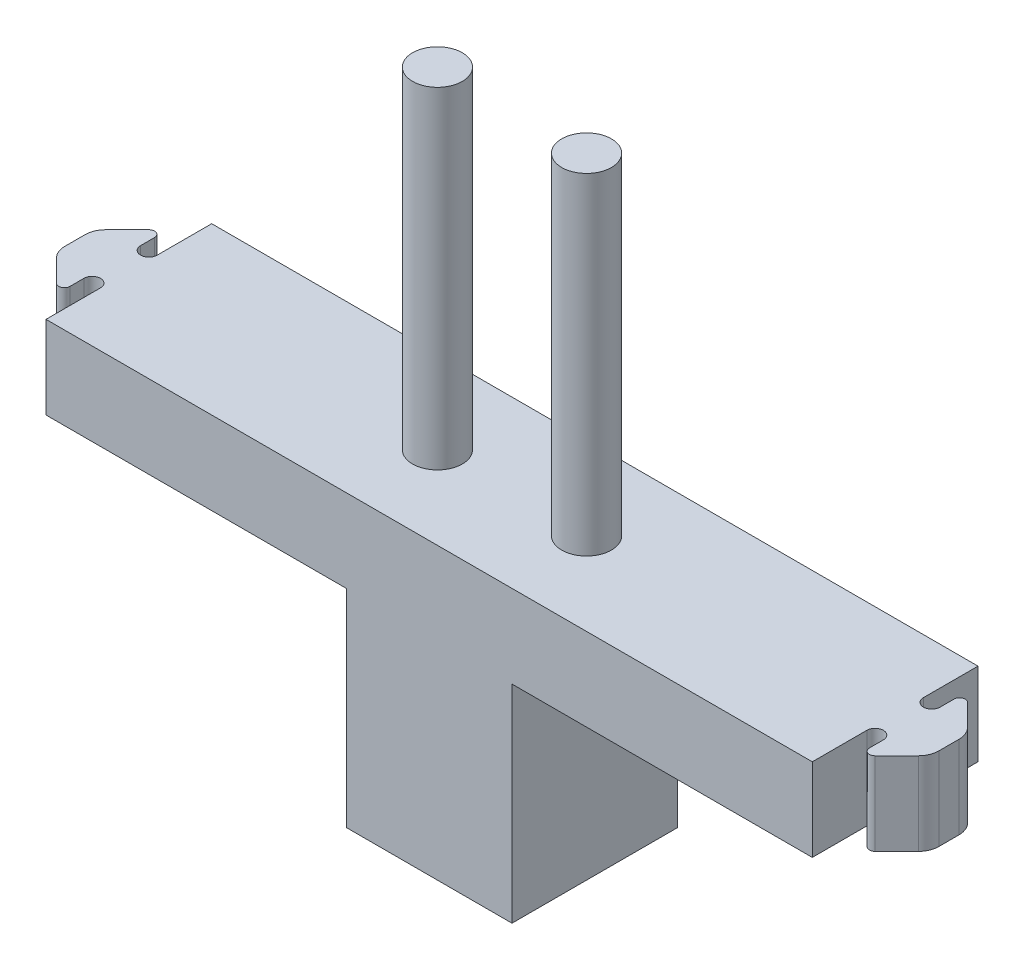
ISO-10303-21;
HEADER;
FILE_DESCRIPTION(('STEP AP214'),'2;1');
FILE_NAME('part.step','',(''),(''),'','','');
FILE_SCHEMA(('AUTOMOTIVE_DESIGN { 1 0 10303 214 1 1 1 1 }'));
ENDSEC;
DATA;
#1=APPLICATION_CONTEXT('core data for automotive mechanical design processes');
#2=APPLICATION_PROTOCOL_DEFINITION('international standard','automotive_design',2000,#1);
#3=PRODUCT_CONTEXT('',#1,'mechanical');
#4=PRODUCT('Part','Part','',(#3));
#5=PRODUCT_RELATED_PRODUCT_CATEGORY('part','',(#4));
#6=PRODUCT_DEFINITION_FORMATION('','',#4);
#7=PRODUCT_DEFINITION_CONTEXT('part definition',#1,'design');
#8=PRODUCT_DEFINITION('design','',#6,#7);
#9=PRODUCT_DEFINITION_SHAPE('','',#8);
#10=(LENGTH_UNIT() NAMED_UNIT(*) SI_UNIT(.MILLI.,.METRE.));
#11=(NAMED_UNIT(*) PLANE_ANGLE_UNIT() SI_UNIT($,.RADIAN.));
#12=(NAMED_UNIT(*) SI_UNIT($,.STERADIAN.) SOLID_ANGLE_UNIT());
#13=UNCERTAINTY_MEASURE_WITH_UNIT(LENGTH_MEASURE(1.E-05),#10,'distance_accuracy_value','');
#14=(GEOMETRIC_REPRESENTATION_CONTEXT(3) GLOBAL_UNCERTAINTY_ASSIGNED_CONTEXT((#13)) GLOBAL_UNIT_ASSIGNED_CONTEXT((#10,
#11,#12)) REPRESENTATION_CONTEXT('',''));
#15=CARTESIAN_POINT('',(0.,0.,0.));
#16=DIRECTION('',(0.,0.,1.));
#17=DIRECTION('',(1.,0.,0.));
#18=AXIS2_PLACEMENT_3D('',#15,#16,#17);
#19=CARTESIAN_POINT('',(0.,0.,0.));
#20=DIRECTION('',(0.,-1.,0.));
#21=DIRECTION('',(0.,0.,-1.));
#22=AXIS2_PLACEMENT_3D('',#19,#20,#21);
#23=PLANE('',#22);
#24=DIRECTION('',(-1.,0.,0.));
#25=VECTOR('',#24,1.);
#26=CARTESIAN_POINT('',(0.,0.,25.4));
#27=LINE('',#26,#25);
#28=CARTESIAN_POINT('',(0.,0.,25.4));
#29=VERTEX_POINT('',#28);
#30=CARTESIAN_POINT('',(-46.0375,0.,25.4));
#31=VERTEX_POINT('',#30);
#32=EDGE_CURVE('E567',#29,#31,#27,.T.);
#33=ORIENTED_EDGE('',*,*,#32,.T.);
#34=DIRECTION('',(0.,0.,-1.));
#35=VECTOR('',#34,1.);
#36=CARTESIAN_POINT('',(-46.0375,0.,25.4));
#37=LINE('',#36,#35);
#38=CARTESIAN_POINT('',(-46.0375,0.,0.));
#39=VERTEX_POINT('',#38);
#40=EDGE_CURVE('E282',#31,#39,#37,.T.);
#41=ORIENTED_EDGE('',*,*,#40,.T.);
#42=DIRECTION('',(-1.,0.,0.));
#43=VECTOR('',#42,1.);
#44=CARTESIAN_POINT('',(0.,0.,0.));
#45=LINE('',#44,#43);
#46=CARTESIAN_POINT('',(0.,0.,0.));
#47=VERTEX_POINT('',#46);
#48=EDGE_CURVE('E267',#47,#39,#45,.T.);
#49=ORIENTED_EDGE('',*,*,#48,.F.);
#50=DIRECTION('',(0.,0.,1.));
#51=VECTOR('',#50,1.);
#52=CARTESIAN_POINT('',(0.,0.,0.));
#53=LINE('',#52,#51);
#54=CARTESIAN_POINT('',(0.,0.,8.35659999999997));
#55=VERTEX_POINT('',#54);
#56=EDGE_CURVE('E562',#47,#55,#53,.T.);
#57=ORIENTED_EDGE('',*,*,#56,.T.);
#58=CARTESIAN_POINT('',(1.27000000000001,0.,8.35659999999997));
#59=DIRECTION('',(0.,-1.,0.));
#60=DIRECTION('',(0.,0.,1.));
#61=AXIS2_PLACEMENT_3D('',#58,#59,#60);
#62=CIRCLE('',#61,1.27000000000001);
#63=CARTESIAN_POINT('',(2.54000000000002,0.,8.35659999999997));
#64=VERTEX_POINT('',#63);
#65=EDGE_CURVE('E424',#64,#55,#62,.T.);
#66=ORIENTED_EDGE('',*,*,#65,.F.);
#67=DIRECTION('',(0.,0.,1.));
#68=VECTOR('',#67,1.);
#69=CARTESIAN_POINT('',(2.54000000000002,0.,8.35659999999997));
#70=LINE('',#69,#68);
#71=CARTESIAN_POINT('',(2.54000000000002,0.,6.22299999999997));
#72=VERTEX_POINT('',#71);
#73=EDGE_CURVE('E420',#72,#64,#70,.T.);
#74=ORIENTED_EDGE('',*,*,#73,.F.);
#75=CARTESIAN_POINT('',(3.40360000000002,0.,6.22299999999998));
#76=DIRECTION('',(0.,1.,0.));
#77=DIRECTION('',(0.,0.,-1.));
#78=AXIS2_PLACEMENT_3D('',#75,#76,#77);
#79=CIRCLE('',#78,0.863600000000003);
#80=CARTESIAN_POINT('',(4.01425741623272,0.,5.61234258376727));
#81=VERTEX_POINT('',#80);
#82=EDGE_CURVE('E416',#81,#72,#79,.T.);
#83=ORIENTED_EDGE('',*,*,#82,.F.);
#84=DIRECTION('',(-0.707106781186547,0.,-0.707106781186547));
#85=VECTOR('',#84,1.);
#86=CARTESIAN_POINT('',(4.01425741623272,0.,5.61234258376727));
#87=LINE('',#86,#85);
#88=CARTESIAN_POINT('',(7.33695218102832,0.,8.93503734856287));
#89=VERTEX_POINT('',#88);
#90=EDGE_CURVE('E412',#89,#81,#87,.T.);
#91=ORIENTED_EDGE('',*,*,#90,.F.);
#92=CARTESIAN_POINT('',(5.07627105699759,0.,11.1643748859159));
#93=DIRECTION('',(0.,1.,0.));
#94=DIRECTION('',(0.,0.,-1.));
#95=AXIS2_PLACEMENT_3D('',#92,#93,#94);
#96=CIRCLE('',#95,3.17500000000002);
#97=CARTESIAN_POINT('',(8.25119370011618,0.,11.1865381486048));
#98=VERTEX_POINT('',#97);
#99=EDGE_CURVE('E407',#98,#89,#96,.T.);
#100=ORIENTED_EDGE('',*,*,#99,.F.);
#101=DIRECTION('',(0.,0.,-1.));
#102=VECTOR('',#101,1.);
#103=CARTESIAN_POINT('',(8.25119370011618,0.,11.1865381486048));
#104=LINE('',#103,#102);
#105=CARTESIAN_POINT('',(8.25119370011618,0.,14.2134618513952));
#106=VERTEX_POINT('',#105);
#107=EDGE_CURVE('E403',#106,#98,#104,.T.);
#108=ORIENTED_EDGE('',*,*,#107,.F.);
#109=CARTESIAN_POINT('',(5.07627105699759,0.,14.2356251140841));
#110=DIRECTION('',(0.,-1.,0.));
#111=DIRECTION('',(0.,0.,1.));
#112=AXIS2_PLACEMENT_3D('',#109,#110,#111);
#113=CIRCLE('',#112,3.17500000000002);
#114=CARTESIAN_POINT('',(7.33695218102832,0.,16.4649626514371));
#115=VERTEX_POINT('',#114);
#116=EDGE_CURVE('E308',#106,#115,#113,.T.);
#117=ORIENTED_EDGE('',*,*,#116,.T.);
#118=DIRECTION('',(-0.707106781186547,0.,0.707106781186547));
#119=VECTOR('',#118,1.);
#120=CARTESIAN_POINT('',(4.01425741623272,0.,19.7876574162327));
#121=LINE('',#120,#119);
#122=CARTESIAN_POINT('',(4.01425741623272,0.,19.7876574162327));
#123=VERTEX_POINT('',#122);
#124=EDGE_CURVE('E305',#115,#123,#121,.T.);
#125=ORIENTED_EDGE('',*,*,#124,.T.);
#126=CARTESIAN_POINT('',(3.40360000000002,0.,19.177));
#127=DIRECTION('',(0.,-1.,0.));
#128=DIRECTION('',(0.,0.,1.));
#129=AXIS2_PLACEMENT_3D('',#126,#127,#128);
#130=CIRCLE('',#129,0.863600000000003);
#131=CARTESIAN_POINT('',(2.54000000000002,0.,19.177));
#132=VERTEX_POINT('',#131);
#133=EDGE_CURVE('E302',#123,#132,#130,.T.);
#134=ORIENTED_EDGE('',*,*,#133,.T.);
#135=DIRECTION('',(0.,0.,-1.));
#136=VECTOR('',#135,1.);
#137=CARTESIAN_POINT('',(2.54000000000002,0.,17.0434));
#138=LINE('',#137,#136);
#139=CARTESIAN_POINT('',(2.54000000000002,0.,17.0434));
#140=VERTEX_POINT('',#139);
#141=EDGE_CURVE('E298',#132,#140,#138,.T.);
#142=ORIENTED_EDGE('',*,*,#141,.T.);
#143=CARTESIAN_POINT('',(1.27000000000001,0.,17.0434));
#144=DIRECTION('',(0.,1.,0.));
#145=DIRECTION('',(0.,0.,-1.));
#146=AXIS2_PLACEMENT_3D('',#143,#144,#145);
#147=CIRCLE('',#146,1.27000000000001);
#148=CARTESIAN_POINT('',(0.,0.,17.0434));
#149=VERTEX_POINT('',#148);
#150=EDGE_CURVE('E294',#140,#149,#147,.T.);
#151=ORIENTED_EDGE('',*,*,#150,.T.);
#152=EDGE_CURVE('E539',#149,#29,#53,.T.);
#153=ORIENTED_EDGE('',*,*,#152,.T.);
#154=EDGE_LOOP('',(#33,#41,#49,#57,#66,#74,#83,#91,#100,#108,#117,#125,#134,#142,#151,#153));
#155=FACE_BOUND('',#154,.T.);
#156=ADVANCED_FACE('F39',(#155),#23,.T.);
#157=CARTESIAN_POINT('',(0.,12.7,0.));
#158=DIRECTION('',(1.,0.,0.));
#159=DIRECTION('',(0.,0.,-1.));
#160=AXIS2_PLACEMENT_3D('',#157,#158,#159);
#161=PLANE('',#160);
#162=ORIENTED_EDGE('',*,*,#152,.F.);
#163=DIRECTION('',(0.,1.,0.));
#164=VECTOR('',#163,1.);
#165=CARTESIAN_POINT('',(0.,0.,17.0434));
#166=LINE('',#165,#164);
#167=CARTESIAN_POINT('',(0.,12.7,17.0434));
#168=VERTEX_POINT('',#167);
#169=EDGE_CURVE('E63',#149,#168,#166,.T.);
#170=ORIENTED_EDGE('',*,*,#169,.T.);
#171=DIRECTION('',(0.,0.,1.));
#172=VECTOR('',#171,1.);
#173=CARTESIAN_POINT('',(0.,12.7,0.));
#174=LINE('',#173,#172);
#175=CARTESIAN_POINT('',(0.,12.7,25.4));
#176=VERTEX_POINT('',#175);
#177=EDGE_CURVE('E549',#168,#176,#174,.T.);
#178=ORIENTED_EDGE('',*,*,#177,.T.);
#179=DIRECTION('',(0.,-1.,0.));
#180=VECTOR('',#179,1.);
#181=CARTESIAN_POINT('',(0.,12.7,25.4));
#182=LINE('',#181,#180);
#183=EDGE_CURVE('E561',#176,#29,#182,.T.);
#184=ORIENTED_EDGE('',*,*,#183,.T.);
#185=EDGE_LOOP('',(#162,#170,#178,#184));
#186=FACE_BOUND('',#185,.T.);
#187=ADVANCED_FACE('F41',(#186),#161,.T.);
#188=CARTESIAN_POINT('',(-117.475,12.7,0.));
#189=DIRECTION('',(1.,0.,0.));
#190=DIRECTION('',(0.,0.,-1.));
#191=AXIS2_PLACEMENT_3D('',#188,#189,#190);
#192=PLANE('',#191);
#193=DIRECTION('',(0.,1.,0.));
#194=VECTOR('',#193,1.);
#195=CARTESIAN_POINT('',(-117.475,0.,17.0434));
#196=LINE('',#195,#194);
#197=CARTESIAN_POINT('',(-117.475,0.,17.0434));
#198=VERTEX_POINT('',#197);
#199=CARTESIAN_POINT('',(-117.475,12.7,17.0434));
#200=VERTEX_POINT('',#199);
#201=EDGE_CURVE('E380',#198,#200,#196,.T.);
#202=ORIENTED_EDGE('',*,*,#201,.F.);
#203=DIRECTION('',(0.,0.,1.));
#204=VECTOR('',#203,1.);
#205=CARTESIAN_POINT('',(-117.475,0.,0.));
#206=LINE('',#205,#204);
#207=CARTESIAN_POINT('',(-117.475,0.,25.4));
#208=VERTEX_POINT('',#207);
#209=EDGE_CURVE('E571',#198,#208,#206,.T.);
#210=ORIENTED_EDGE('',*,*,#209,.T.);
#211=DIRECTION('',(0.,-1.,0.));
#212=VECTOR('',#211,1.);
#213=CARTESIAN_POINT('',(-117.475,12.7,25.4));
#214=LINE('',#213,#212);
#215=CARTESIAN_POINT('',(-117.475,12.7,25.4));
#216=VERTEX_POINT('',#215);
#217=EDGE_CURVE('E584',#216,#208,#214,.T.);
#218=ORIENTED_EDGE('',*,*,#217,.F.);
#219=DIRECTION('',(0.,0.,1.));
#220=VECTOR('',#219,1.);
#221=CARTESIAN_POINT('',(-117.475,12.7,0.));
#222=LINE('',#221,#220);
#223=EDGE_CURVE('E553',#200,#216,#222,.T.);
#224=ORIENTED_EDGE('',*,*,#223,.F.);
#225=EDGE_LOOP('',(#202,#210,#218,#224));
#226=FACE_BOUND('',#225,.T.);
#227=ADVANCED_FACE('F612',(#226),#192,.F.);
#228=CARTESIAN_POINT('',(0.,12.7,0.));
#229=VERTEX_POINT('',#228);
#230=CARTESIAN_POINT('',(0.,12.7,8.35659999999997));
#231=VERTEX_POINT('',#230);
#232=EDGE_CURVE('E544',#229,#231,#174,.T.);
#233=ORIENTED_EDGE('',*,*,#232,.T.);
#234=DIRECTION('',(0.,1.,0.));
#235=VECTOR('',#234,1.);
#236=CARTESIAN_POINT('',(0.,0.,8.35659999999997));
#237=LINE('',#236,#235);
#238=EDGE_CURVE('E450',#55,#231,#237,.T.);
#239=ORIENTED_EDGE('',*,*,#238,.F.);
#240=ORIENTED_EDGE('',*,*,#56,.F.);
#241=DIRECTION('',(0.,-1.,0.));
#242=VECTOR('',#241,1.);
#243=CARTESIAN_POINT('',(0.,12.7,0.));
#244=LINE('',#243,#242);
#245=EDGE_CURVE('E543',#229,#47,#244,.T.);
#246=ORIENTED_EDGE('',*,*,#245,.F.);
#247=EDGE_LOOP('',(#233,#239,#240,#246));
#248=FACE_BOUND('',#247,.T.);
#249=ADVANCED_FACE('F640',(#248),#161,.T.);
#250=DIRECTION('',(0.,1.,0.));
#251=VECTOR('',#250,1.);
#252=CARTESIAN_POINT('',(-117.475,0.,8.35659999999997));
#253=LINE('',#252,#251);
#254=CARTESIAN_POINT('',(-117.475,0.,8.35659999999997));
#255=VERTEX_POINT('',#254);
#256=CARTESIAN_POINT('',(-117.475,12.7,8.35659999999997));
#257=VERTEX_POINT('',#256);
#258=EDGE_CURVE('E492',#255,#257,#253,.T.);
#259=ORIENTED_EDGE('',*,*,#258,.T.);
#260=CARTESIAN_POINT('',(-117.475,12.7,0.));
#261=VERTEX_POINT('',#260);
#262=EDGE_CURVE('E554',#261,#257,#222,.T.);
#263=ORIENTED_EDGE('',*,*,#262,.F.);
#264=DIRECTION('',(0.,-1.,0.));
#265=VECTOR('',#264,1.);
#266=CARTESIAN_POINT('',(-117.475,12.7,0.));
#267=LINE('',#266,#265);
#268=CARTESIAN_POINT('',(-117.475,0.,0.));
#269=VERTEX_POINT('',#268);
#270=EDGE_CURVE('E580',#261,#269,#267,.T.);
#271=ORIENTED_EDGE('',*,*,#270,.T.);
#272=EDGE_CURVE('E572',#269,#255,#206,.T.);
#273=ORIENTED_EDGE('',*,*,#272,.T.);
#274=EDGE_LOOP('',(#259,#263,#271,#273));
#275=FACE_BOUND('',#274,.T.);
#276=ADVANCED_FACE('F626',(#275),#192,.F.);
#277=CARTESIAN_POINT('',(0.,12.7,0.));
#278=DIRECTION('',(0.,0.,1.));
#279=DIRECTION('',(1.,0.,0.));
#280=AXIS2_PLACEMENT_3D('',#277,#278,#279);
#281=PLANE('',#280);
#282=ORIENTED_EDGE('',*,*,#48,.T.);
#283=DIRECTION('',(0.,1.,0.));
#284=VECTOR('',#283,1.);
#285=CARTESIAN_POINT('',(-46.0375,-31.75,0.));
#286=LINE('',#285,#284);
#287=CARTESIAN_POINT('',(-46.0375,-31.75,0.));
#288=VERTEX_POINT('',#287);
#289=EDGE_CURVE('E55',#288,#39,#286,.T.);
#290=ORIENTED_EDGE('',*,*,#289,.F.);
#291=DIRECTION('',(1.,0.,0.));
#292=VECTOR('',#291,1.);
#293=CARTESIAN_POINT('',(-71.4375,-31.75,0.));
#294=LINE('',#293,#292);
#295=CARTESIAN_POINT('',(-71.4375,-31.75,0.));
#296=VERTEX_POINT('',#295);
#297=EDGE_CURVE('E251',#296,#288,#294,.T.);
#298=ORIENTED_EDGE('',*,*,#297,.F.);
#299=DIRECTION('',(0.,1.,0.));
#300=VECTOR('',#299,1.);
#301=CARTESIAN_POINT('',(-71.4375,-31.75,0.));
#302=LINE('',#301,#300);
#303=CARTESIAN_POINT('',(-71.4375,0.,0.));
#304=VERTEX_POINT('',#303);
#305=EDGE_CURVE('E281',#296,#304,#302,.T.);
#306=ORIENTED_EDGE('',*,*,#305,.T.);
#307=EDGE_CURVE('E575',#304,#269,#45,.T.);
#308=ORIENTED_EDGE('',*,*,#307,.T.);
#309=ORIENTED_EDGE('',*,*,#270,.F.);
#310=DIRECTION('',(-1.,0.,0.));
#311=VECTOR('',#310,1.);
#312=CARTESIAN_POINT('',(0.,12.7,0.));
#313=LINE('',#312,#311);
#314=EDGE_CURVE('E558',#229,#261,#313,.T.);
#315=ORIENTED_EDGE('',*,*,#314,.F.);
#316=ORIENTED_EDGE('',*,*,#245,.T.);
#317=EDGE_LOOP('',(#282,#290,#298,#306,#308,#309,#315,#316));
#318=FACE_BOUND('',#317,.T.);
#319=ADVANCED_FACE('F265',(#318),#281,.F.);
#320=CARTESIAN_POINT('',(0.,12.7,25.4));
#321=DIRECTION('',(0.,0.,1.));
#322=DIRECTION('',(1.,0.,0.));
#323=AXIS2_PLACEMENT_3D('',#320,#321,#322);
#324=PLANE('',#323);
#325=ORIENTED_EDGE('',*,*,#32,.F.);
#326=ORIENTED_EDGE('',*,*,#183,.F.);
#327=DIRECTION('',(-1.,0.,0.));
#328=VECTOR('',#327,1.);
#329=CARTESIAN_POINT('',(0.,12.7,25.4));
#330=LINE('',#329,#328);
#331=EDGE_CURVE('E548',#176,#216,#330,.T.);
#332=ORIENTED_EDGE('',*,*,#331,.T.);
#333=ORIENTED_EDGE('',*,*,#217,.T.);
#334=CARTESIAN_POINT('',(-71.4375,0.,25.4));
#335=VERTEX_POINT('',#334);
#336=EDGE_CURVE('E566',#335,#208,#27,.T.);
#337=ORIENTED_EDGE('',*,*,#336,.F.);
#338=DIRECTION('',(0.,1.,0.));
#339=VECTOR('',#338,1.);
#340=CARTESIAN_POINT('',(-71.4375,-31.75,25.4));
#341=LINE('',#340,#339);
#342=CARTESIAN_POINT('',(-71.4375,-31.75,25.4));
#343=VERTEX_POINT('',#342);
#344=EDGE_CURVE('E289',#343,#335,#341,.T.);
#345=ORIENTED_EDGE('',*,*,#344,.F.);
#346=DIRECTION('',(1.,0.,0.));
#347=VECTOR('',#346,1.);
#348=CARTESIAN_POINT('',(-71.4375,-31.75,25.4));
#349=LINE('',#348,#347);
#350=CARTESIAN_POINT('',(-46.0375,-31.75,25.4));
#351=VERTEX_POINT('',#350);
#352=EDGE_CURVE('E274',#343,#351,#349,.T.);
#353=ORIENTED_EDGE('',*,*,#352,.T.);
#354=DIRECTION('',(0.,1.,0.));
#355=VECTOR('',#354,1.);
#356=CARTESIAN_POINT('',(-46.0375,-31.75,25.4));
#357=LINE('',#356,#355);
#358=EDGE_CURVE('E270',#351,#31,#357,.T.);
#359=ORIENTED_EDGE('',*,*,#358,.T.);
#360=EDGE_LOOP('',(#325,#326,#332,#333,#337,#345,#353,#359));
#361=FACE_BOUND('',#360,.T.);
#362=ADVANCED_FACE('F593',(#361),#324,.T.);
#363=CARTESIAN_POINT('',(0.,12.7,0.));
#364=DIRECTION('',(0.,-1.,0.));
#365=DIRECTION('',(0.,0.,-1.));
#366=AXIS2_PLACEMENT_3D('',#363,#364,#365);
#367=PLANE('',#366);
#368=ORIENTED_EDGE('',*,*,#177,.F.);
#369=CARTESIAN_POINT('',(1.27000000000001,12.7,17.0434));
#370=DIRECTION('',(0.,1.,0.));
#371=DIRECTION('',(0.,0.,-1.));
#372=AXIS2_PLACEMENT_3D('',#369,#370,#371);
#373=CIRCLE('',#372,1.27000000000001);
#374=CARTESIAN_POINT('',(2.54000000000002,12.7,17.0434));
#375=VERTEX_POINT('',#374);
#376=EDGE_CURVE('E269',#375,#168,#373,.T.);
#377=ORIENTED_EDGE('',*,*,#376,.F.);
#378=DIRECTION('',(0.,0.,-1.));
#379=VECTOR('',#378,1.);
#380=CARTESIAN_POINT('',(2.54000000000002,12.7,17.0434));
#381=LINE('',#380,#379);
#382=CARTESIAN_POINT('',(2.54000000000002,12.7,19.177));
#383=VERTEX_POINT('',#382);
#384=EDGE_CURVE('E314',#383,#375,#381,.T.);
#385=ORIENTED_EDGE('',*,*,#384,.F.);
#386=CARTESIAN_POINT('',(3.40360000000002,12.7,19.177));
#387=DIRECTION('',(0.,-1.,0.));
#388=DIRECTION('',(0.,0.,1.));
#389=AXIS2_PLACEMENT_3D('',#386,#387,#388);
#390=CIRCLE('',#389,0.863600000000003);
#391=CARTESIAN_POINT('',(4.01425741623272,12.7,19.7876574162327));
#392=VERTEX_POINT('',#391);
#393=EDGE_CURVE('E317',#392,#383,#390,.T.);
#394=ORIENTED_EDGE('',*,*,#393,.F.);
#395=DIRECTION('',(-0.707106781186547,0.,0.707106781186547));
#396=VECTOR('',#395,1.);
#397=CARTESIAN_POINT('',(4.01425741623272,12.7,19.7876574162327));
#398=LINE('',#397,#396);
#399=CARTESIAN_POINT('',(7.33695218102832,12.7,16.4649626514371));
#400=VERTEX_POINT('',#399);
#401=EDGE_CURVE('E320',#400,#392,#398,.T.);
#402=ORIENTED_EDGE('',*,*,#401,.F.);
#403=CARTESIAN_POINT('',(5.07627105699759,12.7,14.2356251140841));
#404=DIRECTION('',(0.,-1.,0.));
#405=DIRECTION('',(0.,0.,1.));
#406=AXIS2_PLACEMENT_3D('',#403,#404,#405);
#407=CIRCLE('',#406,3.17500000000002);
#408=CARTESIAN_POINT('',(8.25119370011618,12.7,14.2134618513952));
#409=VERTEX_POINT('',#408);
#410=EDGE_CURVE('E299',#409,#400,#407,.T.);
#411=ORIENTED_EDGE('',*,*,#410,.F.);
#412=DIRECTION('',(0.,0.,-1.));
#413=VECTOR('',#412,1.);
#414=CARTESIAN_POINT('',(8.25119370011618,12.7,11.1865381486048));
#415=LINE('',#414,#413);
#416=CARTESIAN_POINT('',(8.25119370011618,12.7,11.1865381486048));
#417=VERTEX_POINT('',#416);
#418=EDGE_CURVE('E383',#409,#417,#415,.T.);
#419=ORIENTED_EDGE('',*,*,#418,.T.);
#420=CARTESIAN_POINT('',(5.07627105699759,12.7,11.1643748859159));
#421=DIRECTION('',(0.,1.,0.));
#422=DIRECTION('',(0.,0.,-1.));
#423=AXIS2_PLACEMENT_3D('',#420,#421,#422);
#424=CIRCLE('',#423,3.17500000000002);
#425=CARTESIAN_POINT('',(7.33695218102832,12.7,8.93503734856287));
#426=VERTEX_POINT('',#425);
#427=EDGE_CURVE('E431',#417,#426,#424,.T.);
#428=ORIENTED_EDGE('',*,*,#427,.T.);
#429=DIRECTION('',(-0.707106781186547,0.,-0.707106781186547));
#430=VECTOR('',#429,1.);
#431=CARTESIAN_POINT('',(4.01425741623272,12.7,5.61234258376727));
#432=LINE('',#431,#430);
#433=CARTESIAN_POINT('',(4.01425741623272,12.7,5.61234258376727));
#434=VERTEX_POINT('',#433);
#435=EDGE_CURVE('E435',#426,#434,#432,.T.);
#436=ORIENTED_EDGE('',*,*,#435,.T.);
#437=CARTESIAN_POINT('',(3.40360000000002,12.7,6.22299999999998));
#438=DIRECTION('',(0.,1.,0.));
#439=DIRECTION('',(0.,0.,-1.));
#440=AXIS2_PLACEMENT_3D('',#437,#438,#439);
#441=CIRCLE('',#440,0.863600000000003);
#442=CARTESIAN_POINT('',(2.54000000000002,12.7,6.22299999999997));
#443=VERTEX_POINT('',#442);
#444=EDGE_CURVE('E439',#434,#443,#441,.T.);
#445=ORIENTED_EDGE('',*,*,#444,.T.);
#446=DIRECTION('',(0.,0.,1.));
#447=VECTOR('',#446,1.);
#448=CARTESIAN_POINT('',(2.54000000000002,12.7,8.35659999999997));
#449=LINE('',#448,#447);
#450=CARTESIAN_POINT('',(2.54000000000002,12.7,8.35659999999997));
#451=VERTEX_POINT('',#450);
#452=EDGE_CURVE('E443',#443,#451,#449,.T.);
#453=ORIENTED_EDGE('',*,*,#452,.T.);
#454=CARTESIAN_POINT('',(1.27000000000001,12.7,8.35659999999997));
#455=DIRECTION('',(0.,-1.,0.));
#456=DIRECTION('',(0.,0.,1.));
#457=AXIS2_PLACEMENT_3D('',#454,#455,#456);
#458=CIRCLE('',#457,1.27000000000001);
#459=EDGE_CURVE('E408',#451,#231,#458,.T.);
#460=ORIENTED_EDGE('',*,*,#459,.T.);
#461=ORIENTED_EDGE('',*,*,#232,.F.);
#462=ORIENTED_EDGE('',*,*,#314,.T.);
#463=ORIENTED_EDGE('',*,*,#262,.T.);
#464=CARTESIAN_POINT('',(-118.745,12.7,8.35659999999997));
#465=DIRECTION('',(0.,-1.,0.));
#466=DIRECTION('',(0.,0.,-1.));
#467=AXIS2_PLACEMENT_3D('',#464,#465,#466);
#468=CIRCLE('',#467,1.27000000000001);
#469=CARTESIAN_POINT('',(-120.015,12.7,8.35659999999997));
#470=VERTEX_POINT('',#469);
#471=EDGE_CURVE('E453',#257,#470,#468,.T.);
#472=ORIENTED_EDGE('',*,*,#471,.T.);
#473=DIRECTION('',(0.,0.,-1.));
#474=VECTOR('',#473,1.);
#475=CARTESIAN_POINT('',(-120.015,12.7,8.35659999999997));
#476=LINE('',#475,#474);
#477=CARTESIAN_POINT('',(-120.015,12.7,6.22299999999997));
#478=VERTEX_POINT('',#477);
#479=EDGE_CURVE('E496',#470,#478,#476,.T.);
#480=ORIENTED_EDGE('',*,*,#479,.T.);
#481=CARTESIAN_POINT('',(-120.8786,12.7,6.22299999999998));
#482=DIRECTION('',(0.,1.,0.));
#483=DIRECTION('',(0.,0.,1.));
#484=AXIS2_PLACEMENT_3D('',#481,#482,#483);
#485=CIRCLE('',#484,0.863600000000003);
#486=CARTESIAN_POINT('',(-121.489257416233,12.7,5.61234258376727));
#487=VERTEX_POINT('',#486);
#488=EDGE_CURVE('E500',#478,#487,#485,.T.);
#489=ORIENTED_EDGE('',*,*,#488,.T.);
#490=DIRECTION('',(-0.707106781186547,0.,0.707106781186548));
#491=VECTOR('',#490,1.);
#492=CARTESIAN_POINT('',(-121.489257416233,12.7,5.61234258376727));
#493=LINE('',#492,#491);
#494=CARTESIAN_POINT('',(-124.811952181028,12.7,8.93503734856287));
#495=VERTEX_POINT('',#494);
#496=EDGE_CURVE('E504',#487,#495,#493,.T.);
#497=ORIENTED_EDGE('',*,*,#496,.T.);
#498=CARTESIAN_POINT('',(-122.551271056998,12.7,11.1643748859159));
#499=DIRECTION('',(0.,1.,0.));
#500=DIRECTION('',(0.,0.,1.));
#501=AXIS2_PLACEMENT_3D('',#498,#499,#500);
#502=CIRCLE('',#501,3.17500000000002);
#503=CARTESIAN_POINT('',(-125.726193700116,12.7,11.1865381486048));
#504=VERTEX_POINT('',#503);
#505=EDGE_CURVE('E508',#495,#504,#502,.T.);
#506=ORIENTED_EDGE('',*,*,#505,.T.);
#507=DIRECTION('',(0.,0.,1.));
#508=VECTOR('',#507,1.);
#509=CARTESIAN_POINT('',(-125.726193700116,12.7,11.1865381486048));
#510=LINE('',#509,#508);
#511=CARTESIAN_POINT('',(-125.726193700116,12.7,14.2134618513952));
#512=VERTEX_POINT('',#511);
#513=EDGE_CURVE('E473',#504,#512,#510,.T.);
#514=ORIENTED_EDGE('',*,*,#513,.T.);
#515=CARTESIAN_POINT('',(-122.551271056998,12.7,14.2356251140841));
#516=DIRECTION('',(0.,-1.,0.));
#517=DIRECTION('',(0.,0.,-1.));
#518=AXIS2_PLACEMENT_3D('',#515,#516,#517);
#519=CIRCLE('',#518,3.17500000000002);
#520=CARTESIAN_POINT('',(-124.811952181028,12.7,16.4649626514371));
#521=VERTEX_POINT('',#520);
#522=EDGE_CURVE('E329',#521,#512,#519,.T.);
#523=ORIENTED_EDGE('',*,*,#522,.F.);
#524=DIRECTION('',(-0.707106781186547,0.,-0.707106781186548));
#525=VECTOR('',#524,1.);
#526=CARTESIAN_POINT('',(-121.489257416233,12.7,19.7876574162327));
#527=LINE('',#526,#525);
#528=CARTESIAN_POINT('',(-121.489257416233,12.7,19.7876574162327));
#529=VERTEX_POINT('',#528);
#530=EDGE_CURVE('E369',#529,#521,#527,.T.);
#531=ORIENTED_EDGE('',*,*,#530,.F.);
#532=CARTESIAN_POINT('',(-120.8786,12.7,19.177));
#533=DIRECTION('',(0.,-1.,0.));
#534=DIRECTION('',(0.,0.,-1.));
#535=AXIS2_PLACEMENT_3D('',#532,#533,#534);
#536=CIRCLE('',#535,0.863600000000003);
#537=CARTESIAN_POINT('',(-120.015,12.7,19.177));
#538=VERTEX_POINT('',#537);
#539=EDGE_CURVE('E372',#538,#529,#536,.T.);
#540=ORIENTED_EDGE('',*,*,#539,.F.);
#541=DIRECTION('',(0.,0.,1.));
#542=VECTOR('',#541,1.);
#543=CARTESIAN_POINT('',(-120.015,12.7,17.0434));
#544=LINE('',#543,#542);
#545=CARTESIAN_POINT('',(-120.015,12.7,17.0434));
#546=VERTEX_POINT('',#545);
#547=EDGE_CURVE('E375',#546,#538,#544,.T.);
#548=ORIENTED_EDGE('',*,*,#547,.F.);
#549=CARTESIAN_POINT('',(-118.745,12.7,17.0434));
#550=DIRECTION('',(0.,1.,0.));
#551=DIRECTION('',(0.,0.,1.));
#552=AXIS2_PLACEMENT_3D('',#549,#550,#551);
#553=CIRCLE('',#552,1.27000000000001);
#554=EDGE_CURVE('E353',#200,#546,#553,.T.);
#555=ORIENTED_EDGE('',*,*,#554,.F.);
#556=ORIENTED_EDGE('',*,*,#223,.T.);
#557=ORIENTED_EDGE('',*,*,#331,.F.);
#558=EDGE_LOOP('',(#368,#377,#385,#394,#402,#411,#419,#428,#436,#445,#453,#460,#461,#462,#463,
#472,#480,#489,#497,#506,#514,#523,#531,#540,#548,#555,#556,#557));
#559=FACE_BOUND('',#558,.T.);
#560=CARTESIAN_POINT('',(-70.1675,12.7,12.7));
#561=DIRECTION('',(0.,-1.,0.));
#562=DIRECTION('',(0.,0.,-1.));
#563=AXIS2_PLACEMENT_3D('',#560,#561,#562);
#564=CIRCLE('',#563,3.81);
#565=CARTESIAN_POINT('',(-70.1675,12.7,8.89));
#566=VERTEX_POINT('',#565);
#567=EDGE_CURVE('E11',#566,#566,#564,.F.);
#568=ORIENTED_EDGE('',*,*,#567,.F.);
#569=EDGE_LOOP('',(#568));
#570=FACE_BOUND('',#569,.T.);
#571=CARTESIAN_POINT('',(-47.3075,12.7,12.7));
#572=DIRECTION('',(0.,1.,0.));
#573=DIRECTION('',(0.,0.,1.));
#574=AXIS2_PLACEMENT_3D('',#571,#572,#573);
#575=CIRCLE('',#574,3.81);
#576=CARTESIAN_POINT('',(-47.3075,12.7,16.51));
#577=VERTEX_POINT('',#576);
#578=EDGE_CURVE('E48',#577,#577,#575,.T.);
#579=ORIENTED_EDGE('',*,*,#578,.F.);
#580=EDGE_LOOP('',(#579));
#581=FACE_BOUND('',#580,.T.);
#582=ADVANCED_FACE('F607',(#559,#570,#581),#367,.F.);
#583=DIRECTION('',(0.,0.,-1.));
#584=VECTOR('',#583,1.);
#585=CARTESIAN_POINT('',(-71.4375,0.,25.4));
#586=LINE('',#585,#584);
#587=EDGE_CURVE('E262',#335,#304,#586,.T.);
#588=ORIENTED_EDGE('',*,*,#587,.F.);
#589=ORIENTED_EDGE('',*,*,#336,.T.);
#590=ORIENTED_EDGE('',*,*,#209,.F.);
#591=CARTESIAN_POINT('',(-118.745,0.,17.0434));
#592=DIRECTION('',(0.,1.,0.));
#593=DIRECTION('',(0.,0.,1.));
#594=AXIS2_PLACEMENT_3D('',#591,#592,#593);
#595=CIRCLE('',#594,1.27000000000001);
#596=CARTESIAN_POINT('',(-120.015,0.,17.0434));
#597=VERTEX_POINT('',#596);
#598=EDGE_CURVE('E362',#198,#597,#595,.T.);
#599=ORIENTED_EDGE('',*,*,#598,.T.);
#600=DIRECTION('',(0.,0.,1.));
#601=VECTOR('',#600,1.);
#602=CARTESIAN_POINT('',(-120.015,0.,17.0434));
#603=LINE('',#602,#601);
#604=CARTESIAN_POINT('',(-120.015,0.,19.177));
#605=VERTEX_POINT('',#604);
#606=EDGE_CURVE('E359',#597,#605,#603,.T.);
#607=ORIENTED_EDGE('',*,*,#606,.T.);
#608=CARTESIAN_POINT('',(-120.8786,0.,19.177));
#609=DIRECTION('',(0.,-1.,0.));
#610=DIRECTION('',(0.,0.,-1.));
#611=AXIS2_PLACEMENT_3D('',#608,#609,#610);
#612=CIRCLE('',#611,0.863600000000003);
#613=CARTESIAN_POINT('',(-121.489257416233,0.,19.7876574162327));
#614=VERTEX_POINT('',#613);
#615=EDGE_CURVE('E356',#605,#614,#612,.T.);
#616=ORIENTED_EDGE('',*,*,#615,.T.);
#617=DIRECTION('',(-0.707106781186547,0.,-0.707106781186548));
#618=VECTOR('',#617,1.);
#619=CARTESIAN_POINT('',(-121.489257416233,0.,19.7876574162327));
#620=LINE('',#619,#618);
#621=CARTESIAN_POINT('',(-124.811952181028,0.,16.4649626514371));
#622=VERTEX_POINT('',#621);
#623=EDGE_CURVE('E352',#614,#622,#620,.T.);
#624=ORIENTED_EDGE('',*,*,#623,.T.);
#625=CARTESIAN_POINT('',(-122.551271056998,0.,14.2356251140841));
#626=DIRECTION('',(0.,-1.,0.));
#627=DIRECTION('',(0.,0.,-1.));
#628=AXIS2_PLACEMENT_3D('',#625,#626,#627);
#629=CIRCLE('',#628,3.17500000000002);
#630=CARTESIAN_POINT('',(-125.726193700116,0.,14.2134618513952));
#631=VERTEX_POINT('',#630);
#632=EDGE_CURVE('E348',#622,#631,#629,.T.);
#633=ORIENTED_EDGE('',*,*,#632,.T.);
#634=DIRECTION('',(0.,0.,1.));
#635=VECTOR('',#634,1.);
#636=CARTESIAN_POINT('',(-125.726193700116,0.,11.1865381486048));
#637=LINE('',#636,#635);
#638=CARTESIAN_POINT('',(-125.726193700116,0.,11.1865381486048));
#639=VERTEX_POINT('',#638);
#640=EDGE_CURVE('E489',#639,#631,#637,.T.);
#641=ORIENTED_EDGE('',*,*,#640,.F.);
#642=CARTESIAN_POINT('',(-122.551271056998,0.,11.1643748859159));
#643=DIRECTION('',(0.,1.,0.));
#644=DIRECTION('',(0.,0.,1.));
#645=AXIS2_PLACEMENT_3D('',#642,#643,#644);
#646=CIRCLE('',#645,3.17500000000002);
#647=CARTESIAN_POINT('',(-124.811952181028,0.,8.93503734856287));
#648=VERTEX_POINT('',#647);
#649=EDGE_CURVE('E485',#648,#639,#646,.T.);
#650=ORIENTED_EDGE('',*,*,#649,.F.);
#651=DIRECTION('',(-0.707106781186547,0.,0.707106781186548));
#652=VECTOR('',#651,1.);
#653=CARTESIAN_POINT('',(-121.489257416233,0.,5.61234258376727));
#654=LINE('',#653,#652);
#655=CARTESIAN_POINT('',(-121.489257416233,0.,5.61234258376727));
#656=VERTEX_POINT('',#655);
#657=EDGE_CURVE('E481',#656,#648,#654,.T.);
#658=ORIENTED_EDGE('',*,*,#657,.F.);
#659=CARTESIAN_POINT('',(-120.8786,0.,6.22299999999998));
#660=DIRECTION('',(0.,1.,0.));
#661=DIRECTION('',(0.,0.,1.));
#662=AXIS2_PLACEMENT_3D('',#659,#660,#661);
#663=CIRCLE('',#662,0.863600000000003);
#664=CARTESIAN_POINT('',(-120.015,0.,6.22299999999997));
#665=VERTEX_POINT('',#664);
#666=EDGE_CURVE('E477',#665,#656,#663,.T.);
#667=ORIENTED_EDGE('',*,*,#666,.F.);
#668=DIRECTION('',(0.,0.,-1.));
#669=VECTOR('',#668,1.);
#670=CARTESIAN_POINT('',(-120.015,0.,8.35659999999997));
#671=LINE('',#670,#669);
#672=CARTESIAN_POINT('',(-120.015,0.,8.35659999999997));
#673=VERTEX_POINT('',#672);
#674=EDGE_CURVE('E472',#673,#665,#671,.T.);
#675=ORIENTED_EDGE('',*,*,#674,.F.);
#676=CARTESIAN_POINT('',(-118.745,0.,8.35659999999997));
#677=DIRECTION('',(0.,-1.,0.));
#678=DIRECTION('',(0.,0.,-1.));
#679=AXIS2_PLACEMENT_3D('',#676,#677,#678);
#680=CIRCLE('',#679,1.27000000000001);
#681=EDGE_CURVE('E468',#255,#673,#680,.T.);
#682=ORIENTED_EDGE('',*,*,#681,.F.);
#683=ORIENTED_EDGE('',*,*,#272,.F.);
#684=ORIENTED_EDGE('',*,*,#307,.F.);
#685=EDGE_LOOP('',(#588,#589,#590,#599,#607,#616,#624,#633,#641,#650,#658,#667,#675,#682,#683,#684));
#686=FACE_BOUND('',#685,.T.);
#687=ADVANCED_FACE('F617',(#686),#23,.T.);
#688=CARTESIAN_POINT('',(-47.3075,63.5,12.7));
#689=DIRECTION('',(0.,-1.,0.));
#690=DIRECTION('',(0.,0.,-1.));
#691=AXIS2_PLACEMENT_3D('',#688,#689,#690);
#692=CYLINDRICAL_SURFACE('',#691,3.81);
#693=CARTESIAN_POINT('',(-47.3075,63.5,12.7));
#694=DIRECTION('',(0.,1.,0.));
#695=DIRECTION('',(0.,0.,1.));
#696=AXIS2_PLACEMENT_3D('',#693,#694,#695);
#697=CIRCLE('',#696,3.81);
#698=CARTESIAN_POINT('',(-47.3075,63.5,16.51));
#699=VERTEX_POINT('',#698);
#700=EDGE_CURVE('E535',#699,#699,#697,.T.);
#701=ORIENTED_EDGE('',*,*,#700,.F.);
#702=EDGE_LOOP('',(#701));
#703=FACE_BOUND('',#702,.T.);
#704=ORIENTED_EDGE('',*,*,#578,.T.);
#705=EDGE_LOOP('',(#704));
#706=FACE_BOUND('',#705,.T.);
#707=ADVANCED_FACE('F703',(#703,#706),#692,.T.);
#708=CARTESIAN_POINT('',(-47.3075,63.5,12.7));
#709=DIRECTION('',(0.,1.,0.));
#710=DIRECTION('',(0.,0.,1.));
#711=AXIS2_PLACEMENT_3D('',#708,#709,#710);
#712=PLANE('',#711);
#713=ORIENTED_EDGE('',*,*,#700,.T.);
#714=EDGE_LOOP('',(#713));
#715=FACE_BOUND('',#714,.T.);
#716=ADVANCED_FACE('F708',(#715),#712,.T.);
#717=CARTESIAN_POINT('',(-70.1675,63.5,12.7));
#718=DIRECTION('',(0.,-1.,0.));
#719=DIRECTION('',(0.,0.,-1.));
#720=AXIS2_PLACEMENT_3D('',#717,#718,#719);
#721=CYLINDRICAL_SURFACE('',#720,3.81);
#722=CARTESIAN_POINT('',(-70.1675,63.5,12.7));
#723=DIRECTION('',(0.,1.,0.));
#724=DIRECTION('',(0.,0.,1.));
#725=AXIS2_PLACEMENT_3D('',#722,#723,#724);
#726=CIRCLE('',#725,3.81);
#727=CARTESIAN_POINT('',(-70.1675,63.5,16.51));
#728=VERTEX_POINT('',#727);
#729=EDGE_CURVE('E517',#728,#728,#726,.T.);
#730=ORIENTED_EDGE('',*,*,#729,.F.);
#731=EDGE_LOOP('',(#730));
#732=FACE_BOUND('',#731,.T.);
#733=ORIENTED_EDGE('',*,*,#567,.T.);
#734=EDGE_LOOP('',(#733));
#735=FACE_BOUND('',#734,.T.);
#736=ADVANCED_FACE('F717',(#732,#735),#721,.T.);
#737=CARTESIAN_POINT('',(-70.1675,63.5,12.7));
#738=DIRECTION('',(0.,1.,0.));
#739=DIRECTION('',(0.,0.,1.));
#740=AXIS2_PLACEMENT_3D('',#737,#738,#739);
#741=PLANE('',#740);
#742=ORIENTED_EDGE('',*,*,#729,.T.);
#743=EDGE_LOOP('',(#742));
#744=FACE_BOUND('',#743,.T.);
#745=ADVANCED_FACE('F719',(#744),#741,.T.);
#746=CARTESIAN_POINT('',(-125.726193700116,0.,11.1865381486048));
#747=DIRECTION('',(-1.,0.,0.));
#748=DIRECTION('',(0.,0.,1.));
#749=AXIS2_PLACEMENT_3D('',#746,#747,#748);
#750=PLANE('',#749);
#751=ORIENTED_EDGE('',*,*,#513,.F.);
#752=DIRECTION('',(0.,1.,0.));
#753=VECTOR('',#752,1.);
#754=CARTESIAN_POINT('',(-125.726193700116,0.,11.1865381486048));
#755=LINE('',#754,#753);
#756=EDGE_CURVE('E514',#639,#504,#755,.T.);
#757=ORIENTED_EDGE('',*,*,#756,.F.);
#758=ORIENTED_EDGE('',*,*,#640,.T.);
#759=DIRECTION('',(0.,1.,0.));
#760=VECTOR('',#759,1.);
#761=CARTESIAN_POINT('',(-125.726193700116,0.,14.2134618513952));
#762=LINE('',#761,#760);
#763=EDGE_CURVE('E365',#631,#512,#762,.T.);
#764=ORIENTED_EDGE('',*,*,#763,.T.);
#765=EDGE_LOOP('',(#751,#757,#758,#764));
#766=FACE_BOUND('',#765,.T.);
#767=ADVANCED_FACE('F722',(#766),#750,.T.);
#768=CARTESIAN_POINT('',(-122.551271056998,0.,11.1643748859159));
#769=DIRECTION('',(0.,1.,0.));
#770=DIRECTION('',(0.,0.,1.));
#771=AXIS2_PLACEMENT_3D('',#768,#769,#770);
#772=CYLINDRICAL_SURFACE('',#771,3.17500000000002);
#773=ORIENTED_EDGE('',*,*,#505,.F.);
#774=DIRECTION('',(0.,1.,0.));
#775=VECTOR('',#774,1.);
#776=CARTESIAN_POINT('',(-124.811952181028,0.,8.93503734856287));
#777=LINE('',#776,#775);
#778=EDGE_CURVE('E518',#648,#495,#777,.T.);
#779=ORIENTED_EDGE('',*,*,#778,.F.);
#780=ORIENTED_EDGE('',*,*,#649,.T.);
#781=ORIENTED_EDGE('',*,*,#756,.T.);
#782=EDGE_LOOP('',(#773,#779,#780,#781));
#783=FACE_BOUND('',#782,.T.);
#784=ADVANCED_FACE('F740',(#783),#772,.T.);
#785=CARTESIAN_POINT('',(-121.489257416233,0.,5.61234258376727));
#786=DIRECTION('',(-0.707106781186548,0.,-0.707106781186547));
#787=DIRECTION('',(-0.707106781186547,0.,0.707106781186548));
#788=AXIS2_PLACEMENT_3D('',#785,#786,#787);
#789=PLANE('',#788);
#790=ORIENTED_EDGE('',*,*,#496,.F.);
#791=DIRECTION('',(0.,1.,0.));
#792=VECTOR('',#791,1.);
#793=CARTESIAN_POINT('',(-121.489257416233,0.,5.61234258376727));
#794=LINE('',#793,#792);
#795=EDGE_CURVE('E521',#656,#487,#794,.T.);
#796=ORIENTED_EDGE('',*,*,#795,.F.);
#797=ORIENTED_EDGE('',*,*,#657,.T.);
#798=ORIENTED_EDGE('',*,*,#778,.T.);
#799=EDGE_LOOP('',(#790,#796,#797,#798));
#800=FACE_BOUND('',#799,.T.);
#801=ADVANCED_FACE('F736',(#800),#789,.T.);
#802=CARTESIAN_POINT('',(-120.8786,0.,6.22299999999998));
#803=DIRECTION('',(0.,1.,0.));
#804=DIRECTION('',(0.,0.,1.));
#805=AXIS2_PLACEMENT_3D('',#802,#803,#804);
#806=CYLINDRICAL_SURFACE('',#805,0.863600000000003);
#807=ORIENTED_EDGE('',*,*,#488,.F.);
#808=DIRECTION('',(0.,1.,0.));
#809=VECTOR('',#808,1.);
#810=CARTESIAN_POINT('',(-120.015,0.,6.22299999999997));
#811=LINE('',#810,#809);
#812=EDGE_CURVE('E524',#665,#478,#811,.T.);
#813=ORIENTED_EDGE('',*,*,#812,.F.);
#814=ORIENTED_EDGE('',*,*,#666,.T.);
#815=ORIENTED_EDGE('',*,*,#795,.T.);
#816=EDGE_LOOP('',(#807,#813,#814,#815));
#817=FACE_BOUND('',#816,.T.);
#818=ADVANCED_FACE('F732',(#817),#806,.T.);
#819=CARTESIAN_POINT('',(-120.015,0.,8.35659999999997));
#820=DIRECTION('',(1.,0.,0.));
#821=DIRECTION('',(0.,0.,-1.));
#822=AXIS2_PLACEMENT_3D('',#819,#820,#821);
#823=PLANE('',#822);
#824=ORIENTED_EDGE('',*,*,#479,.F.);
#825=DIRECTION('',(0.,1.,0.));
#826=VECTOR('',#825,1.);
#827=CARTESIAN_POINT('',(-120.015,0.,8.35659999999997));
#828=LINE('',#827,#826);
#829=EDGE_CURVE('E527',#673,#470,#828,.T.);
#830=ORIENTED_EDGE('',*,*,#829,.F.);
#831=ORIENTED_EDGE('',*,*,#674,.T.);
#832=ORIENTED_EDGE('',*,*,#812,.T.);
#833=EDGE_LOOP('',(#824,#830,#831,#832));
#834=FACE_BOUND('',#833,.T.);
#835=ADVANCED_FACE('F729',(#834),#823,.T.);
#836=CARTESIAN_POINT('',(-118.745,0.,8.35659999999997));
#837=DIRECTION('',(0.,1.,0.));
#838=DIRECTION('',(0.,0.,1.));
#839=AXIS2_PLACEMENT_3D('',#836,#837,#838);
#840=CYLINDRICAL_SURFACE('',#839,1.27000000000001);
#841=ORIENTED_EDGE('',*,*,#471,.F.);
#842=ORIENTED_EDGE('',*,*,#258,.F.);
#843=ORIENTED_EDGE('',*,*,#681,.T.);
#844=ORIENTED_EDGE('',*,*,#829,.T.);
#845=EDGE_LOOP('',(#841,#842,#843,#844));
#846=FACE_BOUND('',#845,.T.);
#847=ADVANCED_FACE('F633',(#846),#840,.F.);
#848=CARTESIAN_POINT('',(1.27000000000001,0.,8.35659999999997));
#849=DIRECTION('',(0.,1.,0.));
#850=DIRECTION('',(0.,0.,1.));
#851=AXIS2_PLACEMENT_3D('',#848,#849,#850);
#852=CYLINDRICAL_SURFACE('',#851,1.27000000000001);
#853=ORIENTED_EDGE('',*,*,#459,.F.);
#854=DIRECTION('',(0.,1.,0.));
#855=VECTOR('',#854,1.);
#856=CARTESIAN_POINT('',(2.54000000000002,0.,8.35659999999997));
#857=LINE('',#856,#855);
#858=EDGE_CURVE('E454',#64,#451,#857,.T.);
#859=ORIENTED_EDGE('',*,*,#858,.F.);
#860=ORIENTED_EDGE('',*,*,#65,.T.);
#861=ORIENTED_EDGE('',*,*,#238,.T.);
#862=EDGE_LOOP('',(#853,#859,#860,#861));
#863=FACE_BOUND('',#862,.T.);
#864=ADVANCED_FACE('F643',(#863),#852,.F.);
#865=CARTESIAN_POINT('',(2.54000000000002,0.,8.35659999999997));
#866=DIRECTION('',(-1.,0.,0.));
#867=DIRECTION('',(0.,0.,1.));
#868=AXIS2_PLACEMENT_3D('',#865,#866,#867);
#869=PLANE('',#868);
#870=ORIENTED_EDGE('',*,*,#452,.F.);
#871=DIRECTION('',(0.,1.,0.));
#872=VECTOR('',#871,1.);
#873=CARTESIAN_POINT('',(2.54000000000002,0.,6.22299999999997));
#874=LINE('',#873,#872);
#875=EDGE_CURVE('E457',#72,#443,#874,.T.);
#876=ORIENTED_EDGE('',*,*,#875,.F.);
#877=ORIENTED_EDGE('',*,*,#73,.T.);
#878=ORIENTED_EDGE('',*,*,#858,.T.);
#879=EDGE_LOOP('',(#870,#876,#877,#878));
#880=FACE_BOUND('',#879,.T.);
#881=ADVANCED_FACE('F647',(#880),#869,.T.);
#882=CARTESIAN_POINT('',(3.40360000000002,0.,6.22299999999998));
#883=DIRECTION('',(0.,1.,0.));
#884=DIRECTION('',(0.,0.,1.));
#885=AXIS2_PLACEMENT_3D('',#882,#883,#884);
#886=CYLINDRICAL_SURFACE('',#885,0.863600000000003);
#887=ORIENTED_EDGE('',*,*,#444,.F.);
#888=DIRECTION('',(0.,1.,0.));
#889=VECTOR('',#888,1.);
#890=CARTESIAN_POINT('',(4.01425741623272,0.,5.61234258376727));
#891=LINE('',#890,#889);
#892=EDGE_CURVE('E460',#81,#434,#891,.T.);
#893=ORIENTED_EDGE('',*,*,#892,.F.);
#894=ORIENTED_EDGE('',*,*,#82,.T.);
#895=ORIENTED_EDGE('',*,*,#875,.T.);
#896=EDGE_LOOP('',(#887,#893,#894,#895));
#897=FACE_BOUND('',#896,.T.);
#898=ADVANCED_FACE('F652',(#897),#886,.T.);
#899=CARTESIAN_POINT('',(4.01425741623272,0.,5.61234258376727));
#900=DIRECTION('',(0.707106781186548,0.,-0.707106781186548));
#901=DIRECTION('',(-0.707106781186548,0.,-0.707106781186547));
#902=AXIS2_PLACEMENT_3D('',#899,#900,#901);
#903=PLANE('',#902);
#904=ORIENTED_EDGE('',*,*,#435,.F.);
#905=DIRECTION('',(0.,1.,0.));
#906=VECTOR('',#905,1.);
#907=CARTESIAN_POINT('',(7.33695218102832,0.,8.93503734856287));
#908=LINE('',#907,#906);
#909=EDGE_CURVE('E463',#89,#426,#908,.T.);
#910=ORIENTED_EDGE('',*,*,#909,.F.);
#911=ORIENTED_EDGE('',*,*,#90,.T.);
#912=ORIENTED_EDGE('',*,*,#892,.T.);
#913=EDGE_LOOP('',(#904,#910,#911,#912));
#914=FACE_BOUND('',#913,.T.);
#915=ADVANCED_FACE('F655',(#914),#903,.T.);
#916=CARTESIAN_POINT('',(5.07627105699759,0.,11.1643748859159));
#917=DIRECTION('',(0.,1.,0.));
#918=DIRECTION('',(0.,0.,1.));
#919=AXIS2_PLACEMENT_3D('',#916,#917,#918);
#920=CYLINDRICAL_SURFACE('',#919,3.17500000000002);
#921=ORIENTED_EDGE('',*,*,#427,.F.);
#922=DIRECTION('',(0.,1.,0.));
#923=VECTOR('',#922,1.);
#924=CARTESIAN_POINT('',(8.25119370011618,0.,11.1865381486048));
#925=LINE('',#924,#923);
#926=EDGE_CURVE('E427',#98,#417,#925,.T.);
#927=ORIENTED_EDGE('',*,*,#926,.F.);
#928=ORIENTED_EDGE('',*,*,#99,.T.);
#929=ORIENTED_EDGE('',*,*,#909,.T.);
#930=EDGE_LOOP('',(#921,#927,#928,#929));
#931=FACE_BOUND('',#930,.T.);
#932=ADVANCED_FACE('F659',(#931),#920,.T.);
#933=CARTESIAN_POINT('',(8.25119370011618,0.,11.1865381486048));
#934=DIRECTION('',(1.,0.,0.));
#935=DIRECTION('',(0.,0.,-1.));
#936=AXIS2_PLACEMENT_3D('',#933,#934,#935);
#937=PLANE('',#936);
#938=ORIENTED_EDGE('',*,*,#418,.F.);
#939=DIRECTION('',(0.,1.,0.));
#940=VECTOR('',#939,1.);
#941=CARTESIAN_POINT('',(8.25119370011618,0.,14.2134618513952));
#942=LINE('',#941,#940);
#943=EDGE_CURVE('E325',#106,#409,#942,.T.);
#944=ORIENTED_EDGE('',*,*,#943,.F.);
#945=ORIENTED_EDGE('',*,*,#107,.T.);
#946=ORIENTED_EDGE('',*,*,#926,.T.);
#947=EDGE_LOOP('',(#938,#944,#945,#946));
#948=FACE_BOUND('',#947,.T.);
#949=ADVANCED_FACE('F661',(#948),#937,.T.);
#950=CARTESIAN_POINT('',(-118.745,0.,17.0434));
#951=DIRECTION('',(0.,1.,0.));
#952=DIRECTION('',(0.,0.,1.));
#953=AXIS2_PLACEMENT_3D('',#950,#951,#952);
#954=CYLINDRICAL_SURFACE('',#953,1.27000000000001);
#955=ORIENTED_EDGE('',*,*,#554,.T.);
#956=DIRECTION('',(0.,1.,0.));
#957=VECTOR('',#956,1.);
#958=CARTESIAN_POINT('',(-120.015,0.,17.0434));
#959=LINE('',#958,#957);
#960=EDGE_CURVE('E384',#597,#546,#959,.T.);
#961=ORIENTED_EDGE('',*,*,#960,.F.);
#962=ORIENTED_EDGE('',*,*,#598,.F.);
#963=ORIENTED_EDGE('',*,*,#201,.T.);
#964=EDGE_LOOP('',(#955,#961,#962,#963));
#965=FACE_BOUND('',#964,.T.);
#966=ADVANCED_FACE('F750',(#965),#954,.F.);
#967=CARTESIAN_POINT('',(-120.015,0.,17.0434));
#968=DIRECTION('',(-1.,0.,0.));
#969=DIRECTION('',(0.,0.,1.));
#970=AXIS2_PLACEMENT_3D('',#967,#968,#969);
#971=PLANE('',#970);
#972=ORIENTED_EDGE('',*,*,#547,.T.);
#973=DIRECTION('',(0.,1.,0.));
#974=VECTOR('',#973,1.);
#975=CARTESIAN_POINT('',(-120.015,0.,19.177));
#976=LINE('',#975,#974);
#977=EDGE_CURVE('E388',#605,#538,#976,.T.);
#978=ORIENTED_EDGE('',*,*,#977,.F.);
#979=ORIENTED_EDGE('',*,*,#606,.F.);
#980=ORIENTED_EDGE('',*,*,#960,.T.);
#981=EDGE_LOOP('',(#972,#978,#979,#980));
#982=FACE_BOUND('',#981,.T.);
#983=ADVANCED_FACE('F772',(#982),#971,.F.);
#984=CARTESIAN_POINT('',(-120.8786,0.,19.177));
#985=DIRECTION('',(0.,1.,0.));
#986=DIRECTION('',(0.,0.,1.));
#987=AXIS2_PLACEMENT_3D('',#984,#985,#986);
#988=CYLINDRICAL_SURFACE('',#987,0.863600000000003);
#989=ORIENTED_EDGE('',*,*,#539,.T.);
#990=DIRECTION('',(0.,1.,0.));
#991=VECTOR('',#990,1.);
#992=CARTESIAN_POINT('',(-121.489257416233,0.,19.7876574162327));
#993=LINE('',#992,#991);
#994=EDGE_CURVE('E392',#614,#529,#993,.T.);
#995=ORIENTED_EDGE('',*,*,#994,.F.);
#996=ORIENTED_EDGE('',*,*,#615,.F.);
#997=ORIENTED_EDGE('',*,*,#977,.T.);
#998=EDGE_LOOP('',(#989,#995,#996,#997));
#999=FACE_BOUND('',#998,.T.);
#1000=ADVANCED_FACE('F768',(#999),#988,.T.);
#1001=CARTESIAN_POINT('',(-121.489257416233,0.,19.7876574162327));
#1002=DIRECTION('',(0.707106781186548,0.,-0.707106781186547));
#1003=DIRECTION('',(-0.707106781186547,0.,-0.707106781186548));
#1004=AXIS2_PLACEMENT_3D('',#1001,#1002,#1003);
#1005=PLANE('',#1004);
#1006=ORIENTED_EDGE('',*,*,#530,.T.);
#1007=DIRECTION('',(0.,1.,0.));
#1008=VECTOR('',#1007,1.);
#1009=CARTESIAN_POINT('',(-124.811952181028,0.,16.4649626514371));
#1010=LINE('',#1009,#1008);
#1011=EDGE_CURVE('E396',#622,#521,#1010,.T.);
#1012=ORIENTED_EDGE('',*,*,#1011,.F.);
#1013=ORIENTED_EDGE('',*,*,#623,.F.);
#1014=ORIENTED_EDGE('',*,*,#994,.T.);
#1015=EDGE_LOOP('',(#1006,#1012,#1013,#1014));
#1016=FACE_BOUND('',#1015,.T.);
#1017=ADVANCED_FACE('F764',(#1016),#1005,.F.);
#1018=CARTESIAN_POINT('',(-122.551271056998,0.,14.2356251140841));
#1019=DIRECTION('',(0.,1.,0.));
#1020=DIRECTION('',(0.,0.,1.));
#1021=AXIS2_PLACEMENT_3D('',#1018,#1019,#1020);
#1022=CYLINDRICAL_SURFACE('',#1021,3.17500000000002);
#1023=ORIENTED_EDGE('',*,*,#522,.T.);
#1024=ORIENTED_EDGE('',*,*,#763,.F.);
#1025=ORIENTED_EDGE('',*,*,#632,.F.);
#1026=ORIENTED_EDGE('',*,*,#1011,.T.);
#1027=EDGE_LOOP('',(#1023,#1024,#1025,#1026));
#1028=FACE_BOUND('',#1027,.T.);
#1029=ADVANCED_FACE('F761',(#1028),#1022,.T.);
#1030=CARTESIAN_POINT('',(5.07627105699759,0.,14.2356251140841));
#1031=DIRECTION('',(0.,1.,0.));
#1032=DIRECTION('',(0.,0.,1.));
#1033=AXIS2_PLACEMENT_3D('',#1030,#1031,#1032);
#1034=CYLINDRICAL_SURFACE('',#1033,3.17500000000002);
#1035=ORIENTED_EDGE('',*,*,#410,.T.);
#1036=DIRECTION('',(0.,1.,0.));
#1037=VECTOR('',#1036,1.);
#1038=CARTESIAN_POINT('',(7.33695218102832,0.,16.4649626514371));
#1039=LINE('',#1038,#1037);
#1040=EDGE_CURVE('E330',#115,#400,#1039,.T.);
#1041=ORIENTED_EDGE('',*,*,#1040,.F.);
#1042=ORIENTED_EDGE('',*,*,#116,.F.);
#1043=ORIENTED_EDGE('',*,*,#943,.T.);
#1044=EDGE_LOOP('',(#1035,#1041,#1042,#1043));
#1045=FACE_BOUND('',#1044,.T.);
#1046=ADVANCED_FACE('F668',(#1045),#1034,.T.);
#1047=CARTESIAN_POINT('',(4.01425741623272,0.,19.7876574162327));
#1048=DIRECTION('',(-0.707106781186548,0.,-0.707106781186548));
#1049=DIRECTION('',(-0.707106781186548,0.,0.707106781186547));
#1050=AXIS2_PLACEMENT_3D('',#1047,#1048,#1049);
#1051=PLANE('',#1050);
#1052=ORIENTED_EDGE('',*,*,#401,.T.);
#1053=DIRECTION('',(0.,1.,0.));
#1054=VECTOR('',#1053,1.);
#1055=CARTESIAN_POINT('',(4.01425741623272,0.,19.7876574162327));
#1056=LINE('',#1055,#1054);
#1057=EDGE_CURVE('E334',#123,#392,#1056,.T.);
#1058=ORIENTED_EDGE('',*,*,#1057,.F.);
#1059=ORIENTED_EDGE('',*,*,#124,.F.);
#1060=ORIENTED_EDGE('',*,*,#1040,.T.);
#1061=EDGE_LOOP('',(#1052,#1058,#1059,#1060));
#1062=FACE_BOUND('',#1061,.T.);
#1063=ADVANCED_FACE('F672',(#1062),#1051,.F.);
#1064=CARTESIAN_POINT('',(3.40360000000002,0.,19.177));
#1065=DIRECTION('',(0.,1.,0.));
#1066=DIRECTION('',(0.,0.,1.));
#1067=AXIS2_PLACEMENT_3D('',#1064,#1065,#1066);
#1068=CYLINDRICAL_SURFACE('',#1067,0.863600000000003);
#1069=ORIENTED_EDGE('',*,*,#393,.T.);
#1070=DIRECTION('',(0.,1.,0.));
#1071=VECTOR('',#1070,1.);
#1072=CARTESIAN_POINT('',(2.54000000000002,0.,19.177));
#1073=LINE('',#1072,#1071);
#1074=EDGE_CURVE('E338',#132,#383,#1073,.T.);
#1075=ORIENTED_EDGE('',*,*,#1074,.F.);
#1076=ORIENTED_EDGE('',*,*,#133,.F.);
#1077=ORIENTED_EDGE('',*,*,#1057,.T.);
#1078=EDGE_LOOP('',(#1069,#1075,#1076,#1077));
#1079=FACE_BOUND('',#1078,.T.);
#1080=ADVANCED_FACE('F677',(#1079),#1068,.T.);
#1081=CARTESIAN_POINT('',(2.54000000000002,0.,17.0434));
#1082=DIRECTION('',(1.,0.,0.));
#1083=DIRECTION('',(0.,0.,-1.));
#1084=AXIS2_PLACEMENT_3D('',#1081,#1082,#1083);
#1085=PLANE('',#1084);
#1086=ORIENTED_EDGE('',*,*,#384,.T.);
#1087=DIRECTION('',(0.,1.,0.));
#1088=VECTOR('',#1087,1.);
#1089=CARTESIAN_POINT('',(2.54000000000002,0.,17.0434));
#1090=LINE('',#1089,#1088);
#1091=EDGE_CURVE('E342',#140,#375,#1090,.T.);
#1092=ORIENTED_EDGE('',*,*,#1091,.F.);
#1093=ORIENTED_EDGE('',*,*,#141,.F.);
#1094=ORIENTED_EDGE('',*,*,#1074,.T.);
#1095=EDGE_LOOP('',(#1086,#1092,#1093,#1094));
#1096=FACE_BOUND('',#1095,.T.);
#1097=ADVANCED_FACE('F681',(#1096),#1085,.F.);
#1098=CARTESIAN_POINT('',(1.27000000000001,0.,17.0434));
#1099=DIRECTION('',(0.,1.,0.));
#1100=DIRECTION('',(0.,0.,1.));
#1101=AXIS2_PLACEMENT_3D('',#1098,#1099,#1100);
#1102=CYLINDRICAL_SURFACE('',#1101,1.27000000000001);
#1103=ORIENTED_EDGE('',*,*,#376,.T.);
#1104=ORIENTED_EDGE('',*,*,#169,.F.);
#1105=ORIENTED_EDGE('',*,*,#150,.F.);
#1106=ORIENTED_EDGE('',*,*,#1091,.T.);
#1107=EDGE_LOOP('',(#1103,#1104,#1105,#1106));
#1108=FACE_BOUND('',#1107,.T.);
#1109=ADVANCED_FACE('F685',(#1108),#1102,.F.);
#1110=CARTESIAN_POINT('',(-46.0375,-31.75,25.4));
#1111=DIRECTION('',(1.,0.,0.));
#1112=DIRECTION('',(0.,0.,-1.));
#1113=AXIS2_PLACEMENT_3D('',#1110,#1111,#1112);
#1114=PLANE('',#1113);
#1115=ORIENTED_EDGE('',*,*,#40,.F.);
#1116=ORIENTED_EDGE('',*,*,#358,.F.);
#1117=DIRECTION('',(0.,0.,-1.));
#1118=VECTOR('',#1117,1.);
#1119=CARTESIAN_POINT('',(-46.0375,-31.75,25.4));
#1120=LINE('',#1119,#1118);
#1121=EDGE_CURVE('E254',#351,#288,#1120,.T.);
#1122=ORIENTED_EDGE('',*,*,#1121,.T.);
#1123=ORIENTED_EDGE('',*,*,#289,.T.);
#1124=EDGE_LOOP('',(#1115,#1116,#1122,#1123));
#1125=FACE_BOUND('',#1124,.T.);
#1126=ADVANCED_FACE('F272',(#1125),#1114,.T.);
#1127=CARTESIAN_POINT('',(-71.4375,-31.75,25.4));
#1128=DIRECTION('',(1.,0.,0.));
#1129=DIRECTION('',(0.,0.,-1.));
#1130=AXIS2_PLACEMENT_3D('',#1127,#1128,#1129);
#1131=PLANE('',#1130);
#1132=ORIENTED_EDGE('',*,*,#587,.T.);
#1133=ORIENTED_EDGE('',*,*,#305,.F.);
#1134=DIRECTION('',(0.,0.,-1.));
#1135=VECTOR('',#1134,1.);
#1136=CARTESIAN_POINT('',(-71.4375,-31.75,25.4));
#1137=LINE('',#1136,#1135);
#1138=EDGE_CURVE('E257',#343,#296,#1137,.T.);
#1139=ORIENTED_EDGE('',*,*,#1138,.F.);
#1140=ORIENTED_EDGE('',*,*,#344,.T.);
#1141=EDGE_LOOP('',(#1132,#1133,#1139,#1140));
#1142=FACE_BOUND('',#1141,.T.);
#1143=ADVANCED_FACE('F621',(#1142),#1131,.F.);
#1144=CARTESIAN_POINT('',(0.,-31.75,0.));
#1145=DIRECTION('',(0.,1.,0.));
#1146=DIRECTION('',(0.,0.,1.));
#1147=AXIS2_PLACEMENT_3D('',#1144,#1145,#1146);
#1148=PLANE('',#1147);
#1149=ORIENTED_EDGE('',*,*,#297,.T.);
#1150=ORIENTED_EDGE('',*,*,#1121,.F.);
#1151=ORIENTED_EDGE('',*,*,#352,.F.);
#1152=ORIENTED_EDGE('',*,*,#1138,.T.);
#1153=EDGE_LOOP('',(#1149,#1150,#1151,#1152));
#1154=FACE_BOUND('',#1153,.T.);
#1155=ADVANCED_FACE('F252',(#1154),#1148,.F.);
#1156=CLOSED_SHELL('',(#156,#187,#227,#249,#276,#319,#362,#582,#687,#707,#716,#736,#745,#767,
#784,#801,#818,#835,#847,#864,#881,#898,#915,#932,#949,#966,#983,#1000,#1017,#1029,#1046,#1063,
#1080,#1097,#1109,#1126,#1143,#1155));
#1157=MANIFOLD_SOLID_BREP('B2',#1156);
#1158=ADVANCED_BREP_SHAPE_REPRESENTATION('',(#18,#1157),#14);
#1159=SHAPE_DEFINITION_REPRESENTATION(#9,#1158);
ENDSEC;
END-ISO-10303-21;
